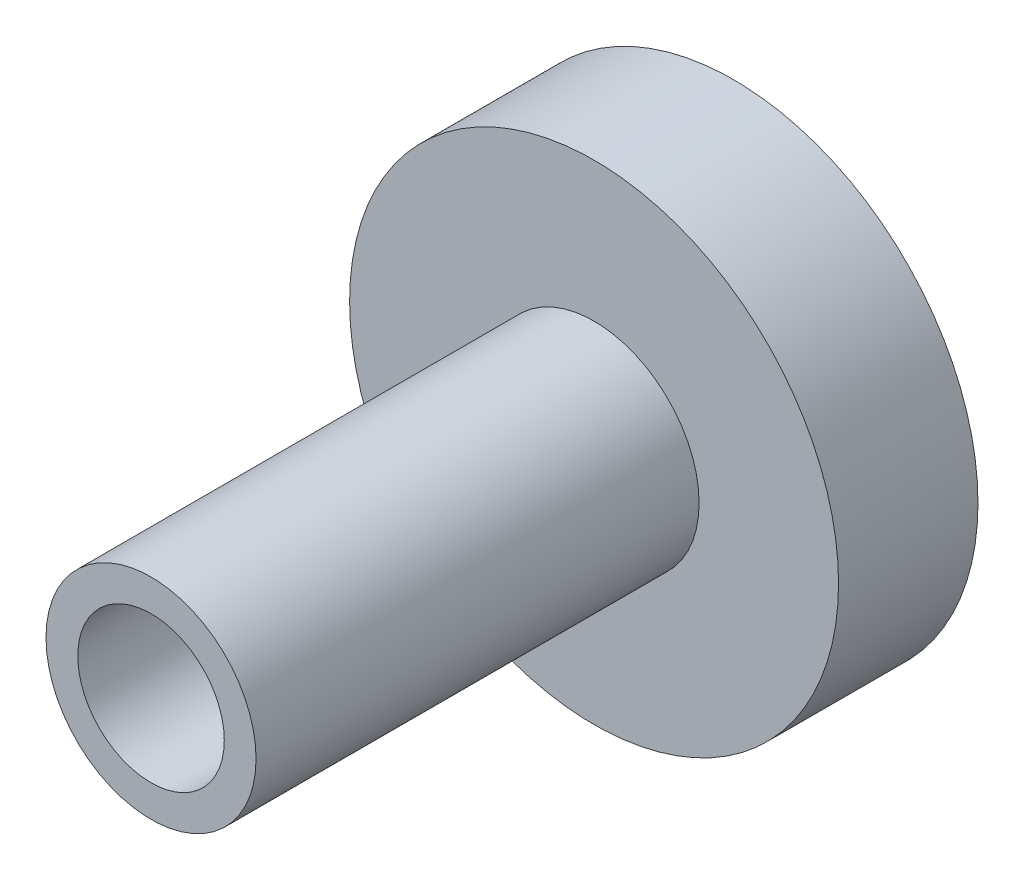
ISO-10303-21;
HEADER;
FILE_DESCRIPTION(('STEP AP214'),'2;1');
FILE_NAME('part.step','',(''),(''),'','','');
FILE_SCHEMA(('AUTOMOTIVE_DESIGN { 1 0 10303 214 1 1 1 1 }'));
ENDSEC;
DATA;
#1=APPLICATION_CONTEXT('core data for automotive mechanical design processes');
#2=APPLICATION_PROTOCOL_DEFINITION('international standard','automotive_design',2000,#1);
#3=PRODUCT_CONTEXT('',#1,'mechanical');
#4=PRODUCT('Part','Part','',(#3));
#5=PRODUCT_RELATED_PRODUCT_CATEGORY('part','',(#4));
#6=PRODUCT_DEFINITION_FORMATION('','',#4);
#7=PRODUCT_DEFINITION_CONTEXT('part definition',#1,'design');
#8=PRODUCT_DEFINITION('design','',#6,#7);
#9=PRODUCT_DEFINITION_SHAPE('','',#8);
#10=(LENGTH_UNIT() NAMED_UNIT(*) SI_UNIT(.MILLI.,.METRE.));
#11=(NAMED_UNIT(*) PLANE_ANGLE_UNIT() SI_UNIT($,.RADIAN.));
#12=(NAMED_UNIT(*) SI_UNIT($,.STERADIAN.) SOLID_ANGLE_UNIT());
#13=UNCERTAINTY_MEASURE_WITH_UNIT(LENGTH_MEASURE(1.E-05),#10,'distance_accuracy_value','');
#14=(GEOMETRIC_REPRESENTATION_CONTEXT(3) GLOBAL_UNCERTAINTY_ASSIGNED_CONTEXT((#13)) GLOBAL_UNIT_ASSIGNED_CONTEXT((#10,
#11,#12)) REPRESENTATION_CONTEXT('',''));
#15=CARTESIAN_POINT('',(0.,0.,0.));
#16=DIRECTION('',(0.,0.,1.));
#17=DIRECTION('',(1.,0.,0.));
#18=AXIS2_PLACEMENT_3D('',#15,#16,#17);
#19=CARTESIAN_POINT('',(0.,0.,33.));
#20=DIRECTION('',(0.,0.,1.));
#21=DIRECTION('',(1.,0.,0.));
#22=AXIS2_PLACEMENT_3D('',#19,#20,#21);
#23=PLANE('',#22);
#24=CARTESIAN_POINT('',(0.,0.,33.));
#25=DIRECTION('',(0.,0.,1.));
#26=DIRECTION('',(1.,0.,0.));
#27=AXIS2_PLACEMENT_3D('',#24,#25,#26);
#28=CIRCLE('',#27,4.15);
#29=CARTESIAN_POINT('',(4.15,0.,33.));
#30=VERTEX_POINT('',#29);
#31=EDGE_CURVE('E38',#30,#30,#28,.T.);
#32=ORIENTED_EDGE('',*,*,#31,.F.);
#33=EDGE_LOOP('',(#32));
#34=FACE_BOUND('',#33,.T.);
#35=CARTESIAN_POINT('',(0.,0.,33.));
#36=DIRECTION('',(0.,0.,1.));
#37=DIRECTION('',(1.,0.,0.));
#38=AXIS2_PLACEMENT_3D('',#35,#36,#37);
#39=CIRCLE('',#38,5.95);
#40=CARTESIAN_POINT('',(5.95,0.,33.));
#41=VERTEX_POINT('',#40);
#42=EDGE_CURVE('E52',#41,#41,#39,.T.);
#43=ORIENTED_EDGE('',*,*,#42,.T.);
#44=EDGE_LOOP('',(#43));
#45=FACE_BOUND('',#44,.T.);
#46=ADVANCED_FACE('F31',(#34,#45),#23,.T.);
#47=CARTESIAN_POINT('',(0.,0.,33.));
#48=DIRECTION('',(0.,0.,-1.));
#49=DIRECTION('',(-1.,0.,0.));
#50=AXIS2_PLACEMENT_3D('',#47,#48,#49);
#51=CYLINDRICAL_SURFACE('',#50,13.85);
#52=CARTESIAN_POINT('',(0.,0.,0.));
#53=DIRECTION('',(0.,0.,1.));
#54=DIRECTION('',(1.,0.,0.));
#55=AXIS2_PLACEMENT_3D('',#52,#53,#54);
#56=CIRCLE('',#55,13.85);
#57=CARTESIAN_POINT('',(13.85,0.,0.));
#58=VERTEX_POINT('',#57);
#59=EDGE_CURVE('E10',#58,#58,#56,.T.);
#60=ORIENTED_EDGE('',*,*,#59,.T.);
#61=EDGE_LOOP('',(#60));
#62=FACE_BOUND('',#61,.T.);
#63=CARTESIAN_POINT('',(0.,0.,7.9));
#64=DIRECTION('',(0.,0.,1.));
#65=DIRECTION('',(1.,0.,0.));
#66=AXIS2_PLACEMENT_3D('',#63,#64,#65);
#67=CIRCLE('',#66,13.85);
#68=CARTESIAN_POINT('',(13.85,0.,7.9));
#69=VERTEX_POINT('',#68);
#70=EDGE_CURVE('E47',#69,#69,#67,.T.);
#71=ORIENTED_EDGE('',*,*,#70,.F.);
#72=EDGE_LOOP('',(#71));
#73=FACE_BOUND('',#72,.T.);
#74=ADVANCED_FACE('F33',(#62,#73),#51,.T.);
#75=CARTESIAN_POINT('',(0.,0.,0.));
#76=DIRECTION('',(0.,0.,1.));
#77=DIRECTION('',(1.,0.,0.));
#78=AXIS2_PLACEMENT_3D('',#75,#76,#77);
#79=PLANE('',#78);
#80=ORIENTED_EDGE('',*,*,#59,.F.);
#81=EDGE_LOOP('',(#80));
#82=FACE_BOUND('',#81,.T.);
#83=CARTESIAN_POINT('',(0.,0.,0.));
#84=DIRECTION('',(0.,0.,1.));
#85=DIRECTION('',(1.,0.,0.));
#86=AXIS2_PLACEMENT_3D('',#83,#84,#85);
#87=CIRCLE('',#86,4.15);
#88=CARTESIAN_POINT('',(4.15,0.,0.));
#89=VERTEX_POINT('',#88);
#90=EDGE_CURVE('E42',#89,#89,#87,.T.);
#91=ORIENTED_EDGE('',*,*,#90,.T.);
#92=EDGE_LOOP('',(#91));
#93=FACE_BOUND('',#92,.T.);
#94=ADVANCED_FACE('F69',(#82,#93),#79,.F.);
#95=CARTESIAN_POINT('',(0.,0.,33.));
#96=DIRECTION('',(0.,0.,-1.));
#97=DIRECTION('',(-1.,0.,0.));
#98=AXIS2_PLACEMENT_3D('',#95,#96,#97);
#99=CYLINDRICAL_SURFACE('',#98,4.15);
#100=ORIENTED_EDGE('',*,*,#31,.T.);
#101=EDGE_LOOP('',(#100));
#102=FACE_BOUND('',#101,.T.);
#103=ORIENTED_EDGE('',*,*,#90,.F.);
#104=EDGE_LOOP('',(#103));
#105=FACE_BOUND('',#104,.T.);
#106=ADVANCED_FACE('F64',(#102,#105),#99,.F.);
#107=CARTESIAN_POINT('',(0.,0.,7.9));
#108=DIRECTION('',(0.,0.,1.));
#109=DIRECTION('',(1.,0.,0.));
#110=AXIS2_PLACEMENT_3D('',#107,#108,#109);
#111=PLANE('',#110);
#112=CARTESIAN_POINT('',(0.,0.,7.9));
#113=DIRECTION('',(0.,0.,1.));
#114=DIRECTION('',(1.,0.,0.));
#115=AXIS2_PLACEMENT_3D('',#112,#113,#114);
#116=CIRCLE('',#115,5.95);
#117=CARTESIAN_POINT('',(5.95,0.,7.9));
#118=VERTEX_POINT('',#117);
#119=EDGE_CURVE('E51',#118,#118,#116,.T.);
#120=ORIENTED_EDGE('',*,*,#119,.F.);
#121=EDGE_LOOP('',(#120));
#122=FACE_BOUND('',#121,.T.);
#123=ORIENTED_EDGE('',*,*,#70,.T.);
#124=EDGE_LOOP('',(#123));
#125=FACE_BOUND('',#124,.T.);
#126=ADVANCED_FACE('F61',(#122,#125),#111,.T.);
#127=CARTESIAN_POINT('',(0.,0.,7.9));
#128=DIRECTION('',(0.,0.,1.));
#129=DIRECTION('',(1.,0.,0.));
#130=AXIS2_PLACEMENT_3D('',#127,#128,#129);
#131=CYLINDRICAL_SURFACE('',#130,5.95);
#132=ORIENTED_EDGE('',*,*,#119,.T.);
#133=EDGE_LOOP('',(#132));
#134=FACE_BOUND('',#133,.T.);
#135=ORIENTED_EDGE('',*,*,#42,.F.);
#136=EDGE_LOOP('',(#135));
#137=FACE_BOUND('',#136,.T.);
#138=ADVANCED_FACE('F58',(#134,#137),#131,.T.);
#139=CLOSED_SHELL('',(#46,#74,#94,#106,#126,#138));
#140=MANIFOLD_SOLID_BREP('B2',#139);
#141=ADVANCED_BREP_SHAPE_REPRESENTATION('',(#18,#140),#14);
#142=SHAPE_DEFINITION_REPRESENTATION(#9,#141);
ENDSEC;
END-ISO-10303-21;
